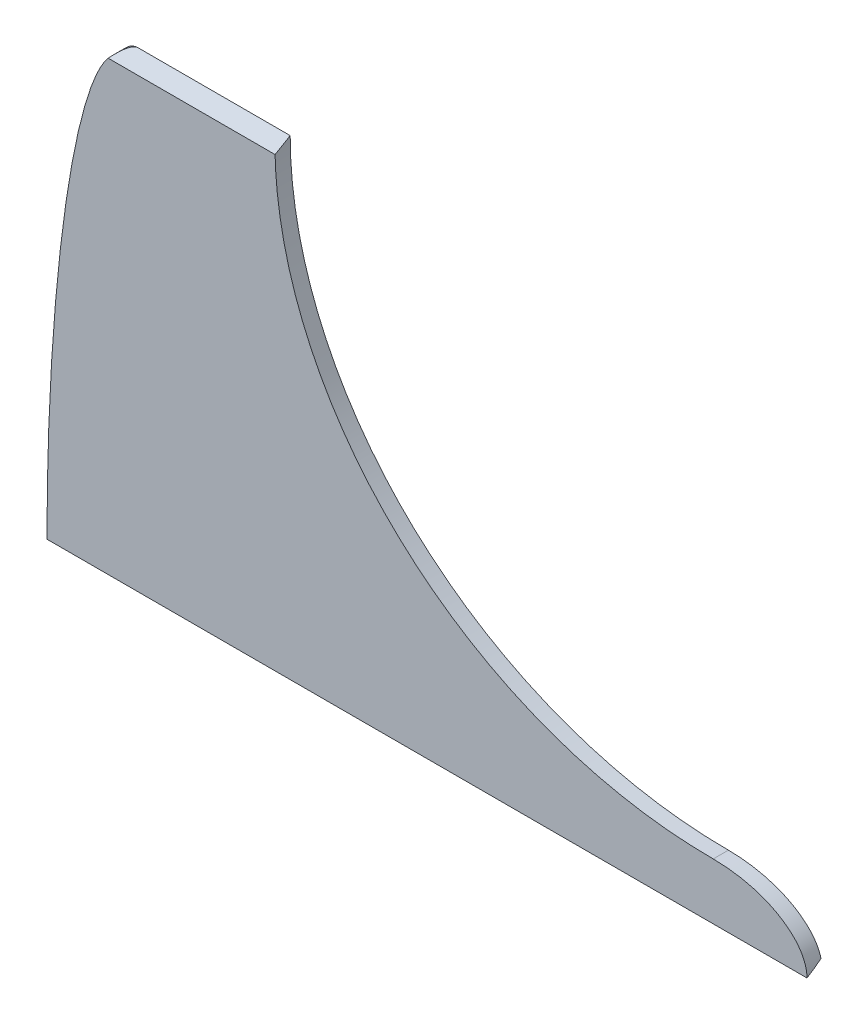
ISO-10303-21;
HEADER;
FILE_DESCRIPTION(('STEP AP214'),'2;1');
FILE_NAME('part.step','',(''),(''),'','','');
FILE_SCHEMA(('AUTOMOTIVE_DESIGN { 1 0 10303 214 1 1 1 1 }'));
ENDSEC;
DATA;
#1=APPLICATION_CONTEXT('core data for automotive mechanical design processes');
#2=APPLICATION_PROTOCOL_DEFINITION('international standard','automotive_design',2000,#1);
#3=PRODUCT_CONTEXT('',#1,'mechanical');
#4=PRODUCT('Part','Part','',(#3));
#5=PRODUCT_RELATED_PRODUCT_CATEGORY('part','',(#4));
#6=PRODUCT_DEFINITION_FORMATION('','',#4);
#7=PRODUCT_DEFINITION_CONTEXT('part definition',#1,'design');
#8=PRODUCT_DEFINITION('design','',#6,#7);
#9=PRODUCT_DEFINITION_SHAPE('','',#8);
#10=(LENGTH_UNIT() NAMED_UNIT(*) SI_UNIT(.MILLI.,.METRE.));
#11=(NAMED_UNIT(*) PLANE_ANGLE_UNIT() SI_UNIT($,.RADIAN.));
#12=(NAMED_UNIT(*) SI_UNIT($,.STERADIAN.) SOLID_ANGLE_UNIT());
#13=UNCERTAINTY_MEASURE_WITH_UNIT(LENGTH_MEASURE(1.E-05),#10,'distance_accuracy_value','');
#14=(GEOMETRIC_REPRESENTATION_CONTEXT(3) GLOBAL_UNCERTAINTY_ASSIGNED_CONTEXT((#13)) GLOBAL_UNIT_ASSIGNED_CONTEXT((#10,
#11,#12)) REPRESENTATION_CONTEXT('',''));
#15=CARTESIAN_POINT('',(0.,0.,0.));
#16=DIRECTION('',(0.,0.,1.));
#17=DIRECTION('',(1.,0.,0.));
#18=AXIS2_PLACEMENT_3D('',#15,#16,#17);
#19=CARTESIAN_POINT('',(-101.6,0.,2.54));
#20=DIRECTION('',(0.,0.,1.));
#21=DIRECTION('',(0.,-1.,0.));
#22=AXIS2_PLACEMENT_3D('',#19,#20,#21);
#23=ELLIPSE('',#22,76.2,12.7);
#24=DIRECTION('',(0.,0.,-1.));
#25=VECTOR('',#24,1.);
#26=SURFACE_OF_LINEAR_EXTRUSION('',#23,#25);
#27=CARTESIAN_POINT('',(-101.6,76.2,0.));
#28=CARTESIAN_POINT('',(-101.633187218264,76.2000087994279,-1.52410562132391E-05));
#29=CARTESIAN_POINT('',(-101.666364115314,76.1992197708021,0.00135139661229992));
#30=CARTESIAN_POINT('',(-101.732385017996,76.1961146631815,0.00672960077416132));
#31=CARTESIAN_POINT('',(-101.765229428865,76.1938007505291,0.0107374150524064));
#32=CARTESIAN_POINT('',(-101.829891711773,76.1877586967398,0.0212025591974158));
#33=CARTESIAN_POINT('',(-101.86171757316,76.1840517637937,0.0276231554003709));
#34=CARTESIAN_POINT('',(-101.924649191018,76.1753334564346,0.0427237067024659));
#35=CARTESIAN_POINT('',(-101.955754652357,76.1703215573499,0.0514045705594789));
#36=CARTESIAN_POINT('',(-102.066993267943,76.1499993341424,0.0866036936775479));
#37=CARTESIAN_POINT('',(-102.144621958308,76.1311928276958,0.119177518356009));
#38=CARTESIAN_POINT('',(-102.293304257167,76.0877002868293,0.194508808887126));
#39=CARTESIAN_POINT('',(-102.364312221168,76.0629771076357,0.23733061137499));
#40=CARTESIAN_POINT('',(-102.49430724486,76.0117563456851,0.32604757347578));
#41=CARTESIAN_POINT('',(-102.553802819851,75.9855752640713,0.371394537028022));
#42=CARTESIAN_POINT('',(-102.668169395123,75.9307787643,0.466304858708954));
#43=CARTESIAN_POINT('',(-102.723035990467,75.9021610783479,0.515872144772965));
#44=CARTESIAN_POINT('',(-102.829082632139,75.8429916271617,0.61835664048336));
#45=CARTESIAN_POINT('',(-102.880240144521,75.8124298653388,0.671291164729523));
#46=CARTESIAN_POINT('',(-102.979110261998,75.7499757470871,0.779464870683413));
#47=CARTESIAN_POINT('',(-103.026824360429,75.7180839770393,0.834703036749382));
#48=CARTESIAN_POINT('',(-103.126325214583,75.648366950794,0.955456468358874));
#49=CARTESIAN_POINT('',(-103.177637869134,75.6103733115948,1.02126338181639));
#50=CARTESIAN_POINT('',(-103.277031975077,75.5333214669685,1.15472109152604));
#51=CARTESIAN_POINT('',(-103.325111642713,75.4942626903009,1.22237287719585));
#52=CARTESIAN_POINT('',(-103.41853628049,75.4152868361754,1.3591630691123));
#53=CARTESIAN_POINT('',(-103.463878479323,75.3753689426377,1.42830288885082));
#54=CARTESIAN_POINT('',(-103.552193105098,75.2948454855939,1.56777360765165));
#55=CARTESIAN_POINT('',(-103.595163676399,75.2542394152147,1.63810538464426));
#56=CARTESIAN_POINT('',(-103.677373854306,75.1740819560504,1.77694217652233));
#57=CARTESIAN_POINT('',(-103.716693582476,75.1345510430273,1.84541172634802));
#58=CARTESIAN_POINT('',(-103.793588889531,75.0551048607211,1.98301655056965));
#59=CARTESIAN_POINT('',(-103.831165755348,75.0151899021881,2.05215128673094));
#60=CARTESIAN_POINT('',(-103.904722224935,74.9350882844698,2.19089135838743));
#61=CARTESIAN_POINT('',(-103.940704783048,74.8949023017495,2.26049552221113));
#62=CARTESIAN_POINT('',(-104.011184184683,74.8143620971129,2.39999524869362));
#63=CARTESIAN_POINT('',(-104.045685499321,74.7740088542119,2.46988911564847));
#64=CARTESIAN_POINT('',(-104.07958019783,74.7335303162584,2.54));
#65=B_SPLINE_CURVE_WITH_KNOTS('',3,(#27,#28,#29,#30,#31,#32,#33,#34,#35,#36,#37,#38,#39,#40,#41,
#42,#43,#44,#45,#46,#47,#48,#49,#50,#51,#52,#53,#54,#55,#56,#57,#58,#59,#60,#61,#62,#63,#64),
.UNSPECIFIED.,.F.,.F.,(4,2,2,2,2,2,2,2,2,2,2,2,2,2,2,2,2,2,4),(0.,0.0995075209376421,
0.19887397935167,0.29678518006111,0.394735807667623,0.651925043556903,0.910773342372625,
1.14818536923539,1.3858208273609,1.62479635757297,1.8636676183682,2.13863484504817,
2.41375255698443,2.68914427180493,2.96474849336017,3.22962420217071,3.49430110698445,
3.75846507128298,4.02176572922565),.UNSPECIFIED.);
#66=CARTESIAN_POINT('',(-101.6,76.2,0.));
#67=VERTEX_POINT('',#66);
#68=CARTESIAN_POINT('',(-104.07958019783,74.7335303162583,2.54));
#69=VERTEX_POINT('',#68);
#70=EDGE_CURVE('E50',#67,#69,#65,.T.);
#71=ORIENTED_EDGE('',*,*,#70,.F.);
#72=CARTESIAN_POINT('',(-101.6,0.,0.));
#73=DIRECTION('',(0.,0.,1.));
#74=DIRECTION('',(0.,-1.,0.));
#75=AXIS2_PLACEMENT_3D('',#72,#73,#74);
#76=ELLIPSE('',#75,76.2,12.7);
#77=CARTESIAN_POINT('',(-114.297647930344,1.46646968374161,0.));
#78=VERTEX_POINT('',#77);
#79=EDGE_CURVE('E88',#67,#78,#76,.T.);
#80=ORIENTED_EDGE('',*,*,#79,.T.);
#81=CARTESIAN_POINT('',(-114.3,0.,2.54000000000006));
#82=CARTESIAN_POINT('',(-114.300000026975,0.244411771154495,2.11666639439248));
#83=CARTESIAN_POINT('',(-114.299804034657,0.48882346371024,1.69333292492202));
#84=CARTESIAN_POINT('',(-114.299020011439,0.977646691624133,0.846666258255337));
#85=CARTESIAN_POINT('',(-114.298431980537,1.22205822698228,0.42333306105911));
#86=CARTESIAN_POINT('',(-114.297647930344,1.46646968374163,0.));
#87=B_SPLINE_CURVE_WITH_KNOTS('',3,(#81,#82,#83,#84,#85,#86),.UNSPECIFIED.,.F.,.F.,(4,2,4),(0.,
1.4664702732083,2.9329405464166),.UNSPECIFIED.);
#88=CARTESIAN_POINT('',(-114.3,0.,2.54));
#89=VERTEX_POINT('',#88);
#90=EDGE_CURVE('E57',#89,#78,#87,.T.);
#91=ORIENTED_EDGE('',*,*,#90,.F.);
#92=EDGE_CURVE('E94',#69,#89,#23,.T.);
#93=ORIENTED_EDGE('',*,*,#92,.F.);
#94=EDGE_LOOP('',(#71,#80,#91,#93));
#95=FACE_BOUND('',#94,.T.);
#96=ADVANCED_FACE('F33',(#95),#26,.F.);
#97=CARTESIAN_POINT('',(-2.962996758194,76.2,2.54));
#98=DIRECTION('',(0.,0.,-1.));
#99=DIRECTION('',(1.,0.,0.));
#100=AXIS2_PLACEMENT_3D('',#97,#98,#99);
#101=ELLIPSE('',#100,73.237003241806,66.7995284447858);
#102=DIRECTION('',(0.,0.,-1.));
#103=VECTOR('',#102,1.);
#104=SURFACE_OF_LINEAR_EXTRUSION('',#101,#103);
#105=CARTESIAN_POINT('',(-76.1823496918921,74.7335303162584,2.54));
#106=CARTESIAN_POINT('',(-76.1882332872763,74.977933078167,2.11668199886409));
#107=CARTESIAN_POINT('',(-76.1926459439774,75.2223402660998,1.69335633162947));
#108=CARTESIAN_POINT('',(-76.1985293800134,75.7111634940136,0.8466896649628));
#109=CARTESIAN_POINT('',(-76.2000001593483,75.9555795339947,0.423348665530757));
#110=CARTESIAN_POINT('',(-76.2,76.2,0.));
#111=B_SPLINE_CURVE_WITH_KNOTS('',3,(#105,#106,#107,#108,#109,#110),.UNSPECIFIED.,.F.,.F.,(4,2,
4),(0.,1.46650287770877,2.93300575541754),.UNSPECIFIED.);
#112=CARTESIAN_POINT('',(-76.1823496918921,74.7335303162584,2.54));
#113=VERTEX_POINT('',#112);
#114=CARTESIAN_POINT('',(-76.2,76.2,0.));
#115=VERTEX_POINT('',#114);
#116=EDGE_CURVE('E83',#113,#115,#111,.T.);
#117=ORIENTED_EDGE('',*,*,#116,.F.);
#118=CARTESIAN_POINT('',(-2.962996758194,9.40047155521423,2.54));
#119=VERTEX_POINT('',#118);
#120=EDGE_CURVE('E119',#119,#113,#101,.T.);
#121=ORIENTED_EDGE('',*,*,#120,.F.);
#122=DIRECTION('',(0.,0.,-1.));
#123=VECTOR('',#122,1.);
#124=CARTESIAN_POINT('',(-2.962996758194,9.40047155521423,2.54));
#125=LINE('',#124,#123);
#126=CARTESIAN_POINT('',(-2.962996758194,9.40047155521423,0.));
#127=VERTEX_POINT('',#126);
#128=EDGE_CURVE('E105',#119,#127,#125,.T.);
#129=ORIENTED_EDGE('',*,*,#128,.T.);
#130=CARTESIAN_POINT('',(-2.962996758194,76.2,0.));
#131=DIRECTION('',(0.,0.,-1.));
#132=DIRECTION('',(1.,0.,0.));
#133=AXIS2_PLACEMENT_3D('',#130,#131,#132);
#134=ELLIPSE('',#133,73.237003241806,66.7995284447858);
#135=EDGE_CURVE('E89',#127,#115,#134,.T.);
#136=ORIENTED_EDGE('',*,*,#135,.T.);
#137=EDGE_LOOP('',(#117,#121,#129,#136));
#138=FACE_BOUND('',#137,.T.);
#139=ADVANCED_FACE('F125',(#138),#104,.F.);
#140=CARTESIAN_POINT('',(-2.96299675819399,0.,2.54));
#141=DIRECTION('',(0.,0.,1.));
#142=DIRECTION('',(1.,0.,0.));
#143=AXIS2_PLACEMENT_3D('',#140,#141,#142);
#144=PLANE('',#143);
#145=ORIENTED_EDGE('',*,*,#120,.T.);
#146=DIRECTION('',(-1.,0.,0.));
#147=VECTOR('',#146,1.);
#148=CARTESIAN_POINT('',(-2.96299675819399,74.7335303162583,2.54));
#149=LINE('',#148,#147);
#150=EDGE_CURVE('E11',#113,#69,#149,.T.);
#151=ORIENTED_EDGE('',*,*,#150,.T.);
#152=ORIENTED_EDGE('',*,*,#92,.T.);
#153=DIRECTION('',(1.,0.,0.));
#154=VECTOR('',#153,1.);
#155=CARTESIAN_POINT('',(0.,0.,2.54));
#156=LINE('',#155,#154);
#157=CARTESIAN_POINT('',(12.7,0.,2.54));
#158=VERTEX_POINT('',#157);
#159=EDGE_CURVE('E98',#89,#158,#156,.T.);
#160=ORIENTED_EDGE('',*,*,#159,.T.);
#161=CARTESIAN_POINT('',(-2.96299675819399,0.,2.54));
#162=DIRECTION('',(0.,0.,1.));
#163=DIRECTION('',(-1.,0.,0.));
#164=AXIS2_PLACEMENT_3D('',#161,#162,#163);
#165=ELLIPSE('',#164,15.662996758194,9.40047155521425);
#166=EDGE_CURVE('E101',#158,#119,#165,.T.);
#167=ORIENTED_EDGE('',*,*,#166,.T.);
#168=EDGE_LOOP('',(#145,#151,#152,#160,#167));
#169=FACE_BOUND('',#168,.T.);
#170=ADVANCED_FACE('F147',(#169),#144,.T.);
#171=DIRECTION('',(0.,0.,-1.));
#172=VECTOR('',#171,1.);
#173=SURFACE_OF_LINEAR_EXTRUSION('',#165,#172);
#174=CARTESIAN_POINT('',(12.5082398152298,1.46646968374161,0.));
#175=CARTESIAN_POINT('',(12.5242418490388,1.40565927786614,0.105326712605205));
#176=CARTESIAN_POINT('',(12.5392411286184,1.34478301182849,0.210767498357502));
#177=CARTESIAN_POINT('',(12.5672240193749,1.22296429143147,0.42176371139816));
#178=CARTESIAN_POINT('',(12.5802092393461,1.16202192946539,0.527318978656678));
#179=CARTESIAN_POINT('',(12.6041731500287,1.04007137776615,0.738543530210813));
#180=CARTESIAN_POINT('',(12.6151529074425,0.979063240492077,0.844212723644649));
#181=CARTESIAN_POINT('',(12.6351127018608,0.856982077610016,1.05566350040347));
#182=CARTESIAN_POINT('',(12.6440932700641,0.795909073581458,1.16144504635179));
#183=CARTESIAN_POINT('',(12.6840235477902,0.490254475719476,1.69085433941579));
#184=CARTESIAN_POINT('',(12.699991776055,0.245169832965041,2.11535339282134));
#185=CARTESIAN_POINT('',(12.7,0.,2.53999999999998));
#186=B_SPLINE_CURVE_WITH_KNOTS('',3,(#174,#175,#176,#177,#178,#179,#180,#181,#182,#183,#184,
#185),.UNSPECIFIED.,.F.,.F.,(4,2,2,2,2,4),(0.,0.36800249349053,0.735709502332783,
1.10322035519986,1.4706334409666,2.94101976991899),.UNSPECIFIED.);
#187=CARTESIAN_POINT('',(12.5082398152298,1.46646968374161,0.));
#188=VERTEX_POINT('',#187);
#189=EDGE_CURVE('E109',#188,#158,#186,.T.);
#190=ORIENTED_EDGE('',*,*,#189,.F.);
#191=CARTESIAN_POINT('',(-2.96299675819399,0.,0.));
#192=DIRECTION('',(0.,0.,1.));
#193=DIRECTION('',(-1.,0.,0.));
#194=AXIS2_PLACEMENT_3D('',#191,#192,#193);
#195=ELLIPSE('',#194,15.662996758194,9.40047155521425);
#196=EDGE_CURVE('E113',#188,#127,#195,.T.);
#197=ORIENTED_EDGE('',*,*,#196,.T.);
#198=ORIENTED_EDGE('',*,*,#128,.F.);
#199=ORIENTED_EDGE('',*,*,#166,.F.);
#200=EDGE_LOOP('',(#190,#197,#198,#199));
#201=FACE_BOUND('',#200,.T.);
#202=ADVANCED_FACE('F35',(#201),#173,.F.);
#203=CARTESIAN_POINT('',(-2.96299675819399,0.,0.));
#204=DIRECTION('',(0.,0.,1.));
#205=DIRECTION('',(1.,0.,0.));
#206=AXIS2_PLACEMENT_3D('',#203,#204,#205);
#207=PLANE('',#206);
#208=DIRECTION('',(1.,0.,0.));
#209=VECTOR('',#208,1.);
#210=CARTESIAN_POINT('',(-2.96299675819399,1.46646968374161,0.));
#211=LINE('',#210,#209);
#212=EDGE_CURVE('E43',#78,#188,#211,.T.);
#213=ORIENTED_EDGE('',*,*,#212,.F.);
#214=ORIENTED_EDGE('',*,*,#79,.F.);
#215=DIRECTION('',(-1.,0.,0.));
#216=VECTOR('',#215,1.);
#217=CARTESIAN_POINT('',(-76.2,76.1999999999999,0.));
#218=LINE('',#217,#216);
#219=EDGE_CURVE('E80',#115,#67,#218,.T.);
#220=ORIENTED_EDGE('',*,*,#219,.F.);
#221=ORIENTED_EDGE('',*,*,#135,.F.);
#222=ORIENTED_EDGE('',*,*,#196,.F.);
#223=EDGE_LOOP('',(#213,#214,#220,#221,#222));
#224=FACE_BOUND('',#223,.T.);
#225=ADVANCED_FACE('F96',(#224),#207,.F.);
#226=CARTESIAN_POINT('',(-121.252,0.,2.54));
#227=DIRECTION('',(0.,-0.866025403784442,-0.499999999999995));
#228=DIRECTION('',(0.,0.499999999999995,-0.866025403784442));
#229=AXIS2_PLACEMENT_3D('',#226,#227,#228);
#230=PLANE('',#229);
#231=ORIENTED_EDGE('',*,*,#189,.T.);
#232=ORIENTED_EDGE('',*,*,#159,.F.);
#233=ORIENTED_EDGE('',*,*,#90,.T.);
#234=ORIENTED_EDGE('',*,*,#212,.T.);
#235=EDGE_LOOP('',(#231,#232,#233,#234));
#236=FACE_BOUND('',#235,.T.);
#237=ADVANCED_FACE('F108',(#236),#230,.T.);
#238=CARTESIAN_POINT('',(-118.458,76.2,0.));
#239=DIRECTION('',(0.,0.866025403784441,0.499999999999995));
#240=DIRECTION('',(0.,-0.499999999999995,0.866025403784441));
#241=AXIS2_PLACEMENT_3D('',#238,#239,#240);
#242=PLANE('',#241);
#243=ORIENTED_EDGE('',*,*,#70,.T.);
#244=ORIENTED_EDGE('',*,*,#150,.F.);
#245=ORIENTED_EDGE('',*,*,#116,.T.);
#246=ORIENTED_EDGE('',*,*,#219,.T.);
#247=EDGE_LOOP('',(#243,#244,#245,#246));
#248=FACE_BOUND('',#247,.T.);
#249=ADVANCED_FACE('F81',(#248),#242,.T.);
#250=CLOSED_SHELL('',(#96,#139,#170,#202,#225,#237,#249));
#251=MANIFOLD_SOLID_BREP('B2',#250);
#252=ADVANCED_BREP_SHAPE_REPRESENTATION('',(#18,#251),#14);
#253=SHAPE_DEFINITION_REPRESENTATION(#9,#252);
ENDSEC;
END-ISO-10303-21;
